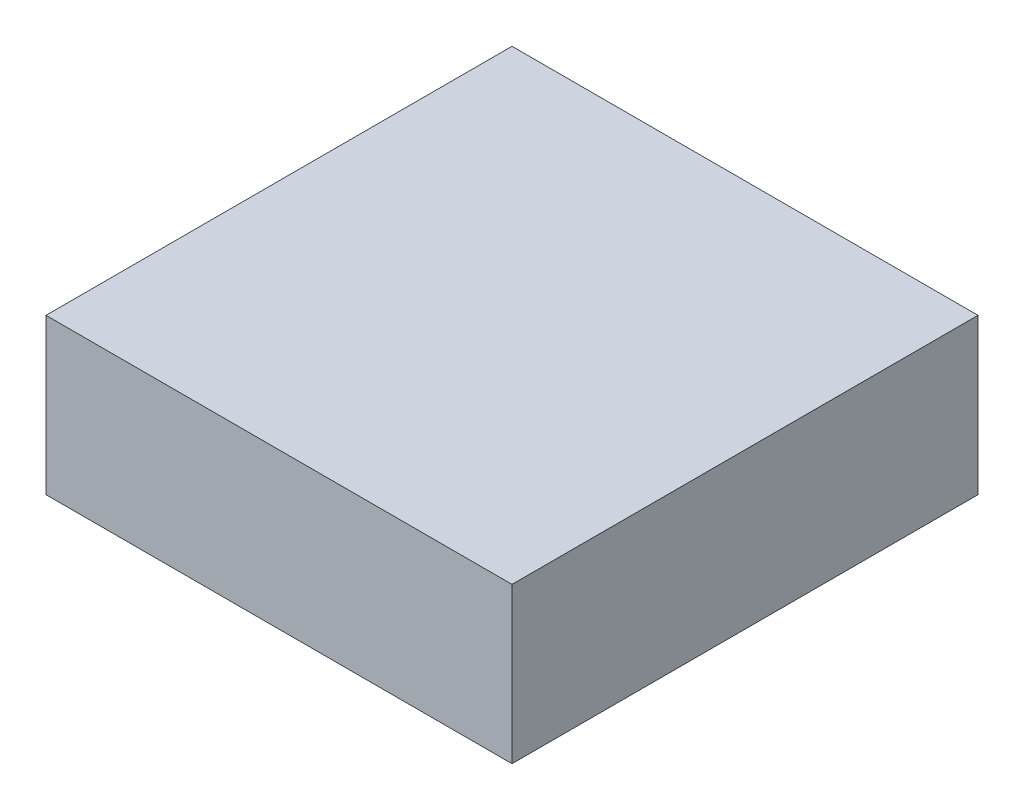
ISO-10303-21;
HEADER;
FILE_DESCRIPTION(('STEP AP214'),'2;1');
FILE_NAME('part.step','',(''),(''),'','','');
FILE_SCHEMA(('AUTOMOTIVE_DESIGN { 1 0 10303 214 1 1 1 1 }'));
ENDSEC;
DATA;
#1=APPLICATION_CONTEXT('core data for automotive mechanical design processes');
#2=APPLICATION_PROTOCOL_DEFINITION('international standard','automotive_design',2000,#1);
#3=PRODUCT_CONTEXT('',#1,'mechanical');
#4=PRODUCT('Part','Part','',(#3));
#5=PRODUCT_RELATED_PRODUCT_CATEGORY('part','',(#4));
#6=PRODUCT_DEFINITION_FORMATION('','',#4);
#7=PRODUCT_DEFINITION_CONTEXT('part definition',#1,'design');
#8=PRODUCT_DEFINITION('design','',#6,#7);
#9=PRODUCT_DEFINITION_SHAPE('','',#8);
#10=(LENGTH_UNIT() NAMED_UNIT(*) SI_UNIT(.MILLI.,.METRE.));
#11=(NAMED_UNIT(*) PLANE_ANGLE_UNIT() SI_UNIT($,.RADIAN.));
#12=(NAMED_UNIT(*) SI_UNIT($,.STERADIAN.) SOLID_ANGLE_UNIT());
#13=UNCERTAINTY_MEASURE_WITH_UNIT(LENGTH_MEASURE(1.E-05),#10,'distance_accuracy_value','');
#14=(GEOMETRIC_REPRESENTATION_CONTEXT(3) GLOBAL_UNCERTAINTY_ASSIGNED_CONTEXT((#13)) GLOBAL_UNIT_ASSIGNED_CONTEXT((#10,
#11,#12)) REPRESENTATION_CONTEXT('',''));
#15=CARTESIAN_POINT('',(0.,0.,0.));
#16=DIRECTION('',(0.,0.,1.));
#17=DIRECTION('',(1.,0.,0.));
#18=AXIS2_PLACEMENT_3D('',#15,#16,#17);
#19=CARTESIAN_POINT('',(76.2,25.4,76.2));
#20=DIRECTION('',(0.,0.,-1.));
#21=DIRECTION('',(0.,1.,0.));
#22=AXIS2_PLACEMENT_3D('',#19,#20,#21);
#23=PLANE('',#22);
#24=DIRECTION('',(0.,-1.,0.));
#25=VECTOR('',#24,1.);
#26=CARTESIAN_POINT('',(-76.2,25.4,76.2));
#27=LINE('',#26,#25);
#28=CARTESIAN_POINT('',(-76.2,25.4,76.2));
#29=VERTEX_POINT('',#28);
#30=CARTESIAN_POINT('',(-76.2,-25.4,76.2));
#31=VERTEX_POINT('',#30);
#32=EDGE_CURVE('E100',#29,#31,#27,.T.);
#33=ORIENTED_EDGE('',*,*,#32,.T.);
#34=DIRECTION('',(-1.,0.,0.));
#35=VECTOR('',#34,1.);
#36=CARTESIAN_POINT('',(76.2,-25.4,76.2));
#37=LINE('',#36,#35);
#38=CARTESIAN_POINT('',(76.2,-25.4,76.2));
#39=VERTEX_POINT('',#38);
#40=EDGE_CURVE('E11',#39,#31,#37,.T.);
#41=ORIENTED_EDGE('',*,*,#40,.F.);
#42=DIRECTION('',(0.,-1.,0.));
#43=VECTOR('',#42,1.);
#44=CARTESIAN_POINT('',(76.2,25.4,76.2));
#45=LINE('',#44,#43);
#46=CARTESIAN_POINT('',(76.2,25.4,76.2));
#47=VERTEX_POINT('',#46);
#48=EDGE_CURVE('E88',#47,#39,#45,.T.);
#49=ORIENTED_EDGE('',*,*,#48,.F.);
#50=DIRECTION('',(-1.,0.,0.));
#51=VECTOR('',#50,1.);
#52=CARTESIAN_POINT('',(76.2,25.4,76.2));
#53=LINE('',#52,#51);
#54=EDGE_CURVE('E96',#47,#29,#53,.T.);
#55=ORIENTED_EDGE('',*,*,#54,.T.);
#56=EDGE_LOOP('',(#33,#41,#49,#55));
#57=FACE_BOUND('',#56,.T.);
#58=ADVANCED_FACE('F37',(#57),#23,.F.);
#59=CARTESIAN_POINT('',(76.2,-25.4,-76.2));
#60=DIRECTION('',(0.,1.,0.));
#61=DIRECTION('',(0.,0.,1.));
#62=AXIS2_PLACEMENT_3D('',#59,#60,#61);
#63=PLANE('',#62);
#64=DIRECTION('',(0.,0.,-1.));
#65=VECTOR('',#64,1.);
#66=CARTESIAN_POINT('',(-76.2,-25.4,-76.2));
#67=LINE('',#66,#65);
#68=CARTESIAN_POINT('',(-76.2,-25.4,-76.2));
#69=VERTEX_POINT('',#68);
#70=EDGE_CURVE('E92',#31,#69,#67,.T.);
#71=ORIENTED_EDGE('',*,*,#70,.T.);
#72=DIRECTION('',(-1.,0.,0.));
#73=VECTOR('',#72,1.);
#74=CARTESIAN_POINT('',(76.2,-25.4,-76.2));
#75=LINE('',#74,#73);
#76=CARTESIAN_POINT('',(76.2,-25.4,-76.2));
#77=VERTEX_POINT('',#76);
#78=EDGE_CURVE('E45',#77,#69,#75,.T.);
#79=ORIENTED_EDGE('',*,*,#78,.F.);
#80=DIRECTION('',(0.,0.,-1.));
#81=VECTOR('',#80,1.);
#82=CARTESIAN_POINT('',(76.2,-25.4,-76.2));
#83=LINE('',#82,#81);
#84=EDGE_CURVE('E83',#39,#77,#83,.T.);
#85=ORIENTED_EDGE('',*,*,#84,.F.);
#86=ORIENTED_EDGE('',*,*,#40,.T.);
#87=EDGE_LOOP('',(#71,#79,#85,#86));
#88=FACE_BOUND('',#87,.T.);
#89=ADVANCED_FACE('F91',(#88),#63,.F.);
#90=CARTESIAN_POINT('',(76.2,25.4,-76.2));
#91=DIRECTION('',(0.,0.,1.));
#92=DIRECTION('',(1.,0.,0.));
#93=AXIS2_PLACEMENT_3D('',#90,#91,#92);
#94=PLANE('',#93);
#95=DIRECTION('',(0.,1.,0.));
#96=VECTOR('',#95,1.);
#97=CARTESIAN_POINT('',(-76.2,25.4,-76.2));
#98=LINE('',#97,#96);
#99=CARTESIAN_POINT('',(-76.2,25.4,-76.2));
#100=VERTEX_POINT('',#99);
#101=EDGE_CURVE('E70',#69,#100,#98,.T.);
#102=ORIENTED_EDGE('',*,*,#101,.T.);
#103=DIRECTION('',(-1.,0.,0.));
#104=VECTOR('',#103,1.);
#105=CARTESIAN_POINT('',(76.2,25.4,-76.2));
#106=LINE('',#105,#104);
#107=CARTESIAN_POINT('',(76.2,25.4,-76.2));
#108=VERTEX_POINT('',#107);
#109=EDGE_CURVE('E93',#108,#100,#106,.T.);
#110=ORIENTED_EDGE('',*,*,#109,.F.);
#111=DIRECTION('',(0.,1.,0.));
#112=VECTOR('',#111,1.);
#113=CARTESIAN_POINT('',(76.2,25.4,-76.2));
#114=LINE('',#113,#112);
#115=EDGE_CURVE('E86',#77,#108,#114,.T.);
#116=ORIENTED_EDGE('',*,*,#115,.F.);
#117=ORIENTED_EDGE('',*,*,#78,.T.);
#118=EDGE_LOOP('',(#102,#110,#116,#117));
#119=FACE_BOUND('',#118,.T.);
#120=ADVANCED_FACE('F94',(#119),#94,.F.);
#121=CARTESIAN_POINT('',(76.2,25.4,-76.2));
#122=DIRECTION('',(0.,-1.,0.));
#123=DIRECTION('',(0.,0.,-1.));
#124=AXIS2_PLACEMENT_3D('',#121,#122,#123);
#125=PLANE('',#124);
#126=DIRECTION('',(0.,0.,1.));
#127=VECTOR('',#126,1.);
#128=CARTESIAN_POINT('',(-76.2,25.4,-76.2));
#129=LINE('',#128,#127);
#130=EDGE_CURVE('E76',#100,#29,#129,.T.);
#131=ORIENTED_EDGE('',*,*,#130,.T.);
#132=ORIENTED_EDGE('',*,*,#54,.F.);
#133=DIRECTION('',(0.,0.,1.));
#134=VECTOR('',#133,1.);
#135=CARTESIAN_POINT('',(76.2,25.4,-76.2));
#136=LINE('',#135,#134);
#137=EDGE_CURVE('E53',#108,#47,#136,.T.);
#138=ORIENTED_EDGE('',*,*,#137,.F.);
#139=ORIENTED_EDGE('',*,*,#109,.T.);
#140=EDGE_LOOP('',(#131,#132,#138,#139));
#141=FACE_BOUND('',#140,.T.);
#142=ADVANCED_FACE('F107',(#141),#125,.F.);
#143=CARTESIAN_POINT('',(76.2,0.,0.));
#144=DIRECTION('',(-1.,0.,0.));
#145=DIRECTION('',(0.,0.,1.));
#146=AXIS2_PLACEMENT_3D('',#143,#144,#145);
#147=PLANE('',#146);
#148=ORIENTED_EDGE('',*,*,#48,.T.);
#149=ORIENTED_EDGE('',*,*,#84,.T.);
#150=ORIENTED_EDGE('',*,*,#115,.T.);
#151=ORIENTED_EDGE('',*,*,#137,.T.);
#152=EDGE_LOOP('',(#148,#149,#150,#151));
#153=FACE_BOUND('',#152,.T.);
#154=ADVANCED_FACE('F84',(#153),#147,.F.);
#155=CARTESIAN_POINT('',(-76.2,0.,0.));
#156=DIRECTION('',(-1.,0.,0.));
#157=DIRECTION('',(0.,0.,1.));
#158=AXIS2_PLACEMENT_3D('',#155,#156,#157);
#159=PLANE('',#158);
#160=ORIENTED_EDGE('',*,*,#32,.F.);
#161=ORIENTED_EDGE('',*,*,#130,.F.);
#162=ORIENTED_EDGE('',*,*,#101,.F.);
#163=ORIENTED_EDGE('',*,*,#70,.F.);
#164=EDGE_LOOP('',(#160,#161,#162,#163));
#165=FACE_BOUND('',#164,.T.);
#166=ADVANCED_FACE('F110',(#165),#159,.T.);
#167=CLOSED_SHELL('',(#58,#89,#120,#142,#154,#166));
#168=MANIFOLD_SOLID_BREP('B2',#167);
#169=ADVANCED_BREP_SHAPE_REPRESENTATION('',(#18,#168),#14);
#170=SHAPE_DEFINITION_REPRESENTATION(#9,#169);
ENDSEC;
END-ISO-10303-21;
